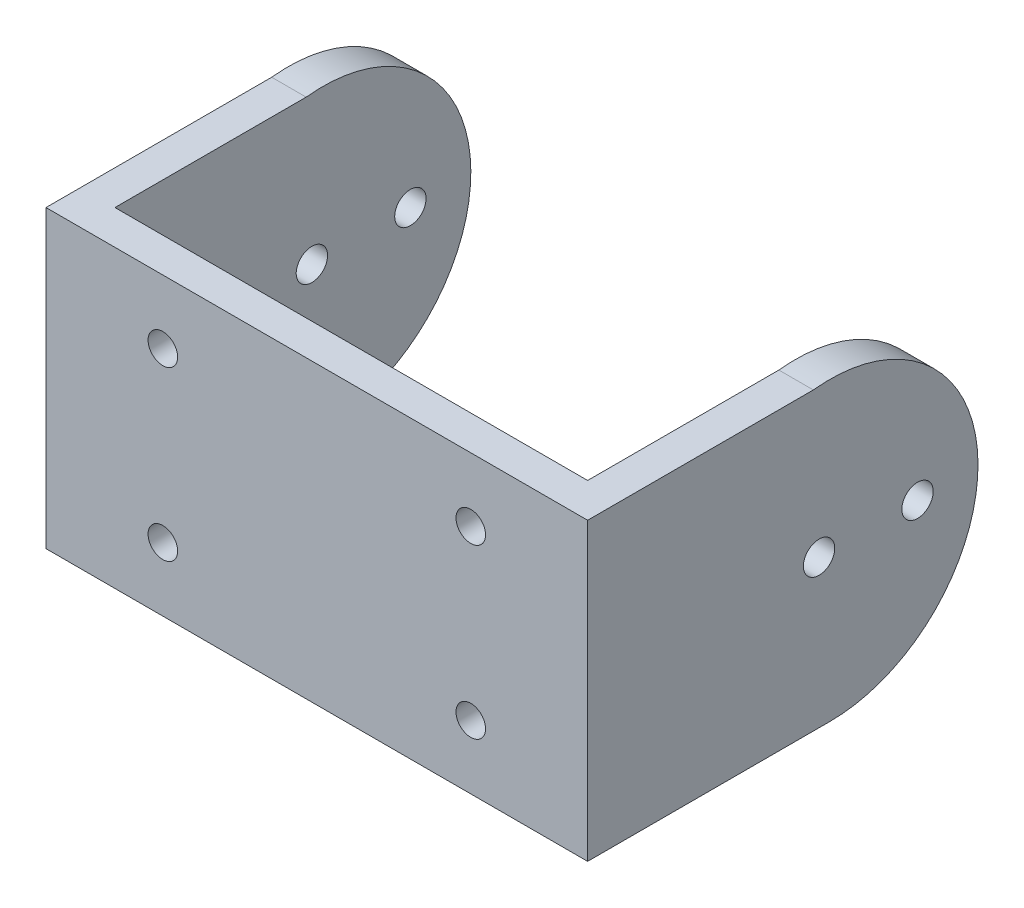
ISO-10303-21;
HEADER;
FILE_DESCRIPTION(('STEP AP214'),'2;1');
FILE_NAME('part.step','',(''),(''),'','','');
FILE_SCHEMA(('AUTOMOTIVE_DESIGN { 1 0 10303 214 1 1 1 1 }'));
ENDSEC;
DATA;
#1=APPLICATION_CONTEXT('core data for automotive mechanical design processes');
#2=APPLICATION_PROTOCOL_DEFINITION('international standard','automotive_design',2000,#1);
#3=PRODUCT_CONTEXT('',#1,'mechanical');
#4=PRODUCT('Part','Part','',(#3));
#5=PRODUCT_RELATED_PRODUCT_CATEGORY('part','',(#4));
#6=PRODUCT_DEFINITION_FORMATION('','',#4);
#7=PRODUCT_DEFINITION_CONTEXT('part definition',#1,'design');
#8=PRODUCT_DEFINITION('design','',#6,#7);
#9=PRODUCT_DEFINITION_SHAPE('','',#8);
#10=(LENGTH_UNIT() NAMED_UNIT(*) SI_UNIT(.MILLI.,.METRE.));
#11=(NAMED_UNIT(*) PLANE_ANGLE_UNIT() SI_UNIT($,.RADIAN.));
#12=(NAMED_UNIT(*) SI_UNIT($,.STERADIAN.) SOLID_ANGLE_UNIT());
#13=UNCERTAINTY_MEASURE_WITH_UNIT(LENGTH_MEASURE(1.E-05),#10,'distance_accuracy_value','');
#14=(GEOMETRIC_REPRESENTATION_CONTEXT(3) GLOBAL_UNCERTAINTY_ASSIGNED_CONTEXT((#13)) GLOBAL_UNIT_ASSIGNED_CONTEXT((#10,
#11,#12)) REPRESENTATION_CONTEXT('',''));
#15=CARTESIAN_POINT('',(0.,0.,0.));
#16=DIRECTION('',(0.,0.,1.));
#17=DIRECTION('',(1.,0.,0.));
#18=AXIS2_PLACEMENT_3D('',#15,#16,#17);
#19=CARTESIAN_POINT('',(0.,0.,3.5));
#20=DIRECTION('',(0.,0.,1.));
#21=DIRECTION('',(1.,0.,0.));
#22=AXIS2_PLACEMENT_3D('',#19,#20,#21);
#23=PLANE('',#22);
#24=CARTESIAN_POINT('',(15.6347464737621,-8.52804353114296,3.5));
#25=DIRECTION('',(0.,0.,1.));
#26=DIRECTION('',(-1.,0.,0.));
#27=AXIS2_PLACEMENT_3D('',#24,#25,#26);
#28=CIRCLE('',#27,1.5);
#29=CARTESIAN_POINT('',(14.1347464737621,-8.52804353114296,3.5));
#30=VERTEX_POINT('',#29);
#31=EDGE_CURVE('E201',#30,#30,#28,.T.);
#32=ORIENTED_EDGE('',*,*,#31,.F.);
#33=EDGE_LOOP('',(#32));
#34=FACE_BOUND('',#33,.T.);
#35=CARTESIAN_POINT('',(15.6347464737621,8.52804353114296,3.5));
#36=DIRECTION('',(0.,0.,1.));
#37=DIRECTION('',(1.,0.,0.));
#38=AXIS2_PLACEMENT_3D('',#35,#36,#37);
#39=CIRCLE('',#38,1.5);
#40=CARTESIAN_POINT('',(17.1347464737621,8.52804353114296,3.5));
#41=VERTEX_POINT('',#40);
#42=EDGE_CURVE('E217',#41,#41,#39,.T.);
#43=ORIENTED_EDGE('',*,*,#42,.F.);
#44=EDGE_LOOP('',(#43));
#45=FACE_BOUND('',#44,.T.);
#46=DIRECTION('',(0.,-1.,0.));
#47=VECTOR('',#46,1.);
#48=CARTESIAN_POINT('',(-27.5,-15.,3.5));
#49=LINE('',#48,#47);
#50=CARTESIAN_POINT('',(-27.5,15.,3.5));
#51=VERTEX_POINT('',#50);
#52=CARTESIAN_POINT('',(-27.5,-15.,3.5));
#53=VERTEX_POINT('',#52);
#54=EDGE_CURVE('E224',#51,#53,#49,.T.);
#55=ORIENTED_EDGE('',*,*,#54,.T.);
#56=DIRECTION('',(1.,0.,0.));
#57=VECTOR('',#56,1.);
#58=CARTESIAN_POINT('',(27.5,-15.,3.5));
#59=LINE('',#58,#57);
#60=CARTESIAN_POINT('',(27.5,-15.,3.5));
#61=VERTEX_POINT('',#60);
#62=EDGE_CURVE('E227',#53,#61,#59,.T.);
#63=ORIENTED_EDGE('',*,*,#62,.T.);
#64=DIRECTION('',(0.,1.,0.));
#65=VECTOR('',#64,1.);
#66=CARTESIAN_POINT('',(27.5,-15.,3.5));
#67=LINE('',#66,#65);
#68=CARTESIAN_POINT('',(27.5,15.,3.5));
#69=VERTEX_POINT('',#68);
#70=EDGE_CURVE('E230',#61,#69,#67,.T.);
#71=ORIENTED_EDGE('',*,*,#70,.T.);
#72=DIRECTION('',(-1.,0.,0.));
#73=VECTOR('',#72,1.);
#74=CARTESIAN_POINT('',(27.5,15.,3.5));
#75=LINE('',#74,#73);
#76=EDGE_CURVE('E63',#69,#51,#75,.T.);
#77=ORIENTED_EDGE('',*,*,#76,.T.);
#78=EDGE_LOOP('',(#55,#63,#71,#77));
#79=FACE_BOUND('',#78,.T.);
#80=CARTESIAN_POINT('',(-15.6347464737621,8.52804353114296,3.5));
#81=DIRECTION('',(0.,0.,1.));
#82=DIRECTION('',(-1.,0.,0.));
#83=AXIS2_PLACEMENT_3D('',#80,#81,#82);
#84=CIRCLE('',#83,1.5);
#85=CARTESIAN_POINT('',(-17.1347464737621,8.52804353114296,3.5));
#86=VERTEX_POINT('',#85);
#87=EDGE_CURVE('E209',#86,#86,#84,.T.);
#88=ORIENTED_EDGE('',*,*,#87,.F.);
#89=EDGE_LOOP('',(#88));
#90=FACE_BOUND('',#89,.T.);
#91=CARTESIAN_POINT('',(-15.6347464737621,-8.52804353114296,3.5));
#92=DIRECTION('',(0.,0.,1.));
#93=DIRECTION('',(1.,0.,0.));
#94=AXIS2_PLACEMENT_3D('',#91,#92,#93);
#95=CIRCLE('',#94,1.5);
#96=CARTESIAN_POINT('',(-14.1347464737621,-8.52804353114296,3.5));
#97=VERTEX_POINT('',#96);
#98=EDGE_CURVE('E193',#97,#97,#95,.T.);
#99=ORIENTED_EDGE('',*,*,#98,.F.);
#100=EDGE_LOOP('',(#99));
#101=FACE_BOUND('',#100,.T.);
#102=ADVANCED_FACE('F39',(#34,#45,#79,#90,#101),#23,.T.);
#103=CARTESIAN_POINT('',(0.,0.,0.));
#104=DIRECTION('',(0.,0.,1.));
#105=DIRECTION('',(1.,0.,0.));
#106=AXIS2_PLACEMENT_3D('',#103,#104,#105);
#107=PLANE('',#106);
#108=DIRECTION('',(1.,0.,0.));
#109=VECTOR('',#108,1.);
#110=CARTESIAN_POINT('',(27.5,-15.,0.));
#111=LINE('',#110,#109);
#112=CARTESIAN_POINT('',(-24.,-15.,0.));
#113=VERTEX_POINT('',#112);
#114=CARTESIAN_POINT('',(24.,-15.,0.));
#115=VERTEX_POINT('',#114);
#116=EDGE_CURVE('E55',#113,#115,#111,.T.);
#117=ORIENTED_EDGE('',*,*,#116,.F.);
#118=DIRECTION('',(0.,-1.,0.));
#119=VECTOR('',#118,1.);
#120=CARTESIAN_POINT('',(-24.,15.,0.));
#121=LINE('',#120,#119);
#122=CARTESIAN_POINT('',(-24.,15.,0.));
#123=VERTEX_POINT('',#122);
#124=EDGE_CURVE('E128',#123,#113,#121,.T.);
#125=ORIENTED_EDGE('',*,*,#124,.F.);
#126=DIRECTION('',(-1.,0.,0.));
#127=VECTOR('',#126,1.);
#128=CARTESIAN_POINT('',(27.5,15.,0.));
#129=LINE('',#128,#127);
#130=CARTESIAN_POINT('',(24.,15.,0.));
#131=VERTEX_POINT('',#130);
#132=EDGE_CURVE('E134',#131,#123,#129,.T.);
#133=ORIENTED_EDGE('',*,*,#132,.F.);
#134=DIRECTION('',(0.,-1.,0.));
#135=VECTOR('',#134,1.);
#136=CARTESIAN_POINT('',(24.,15.,0.));
#137=LINE('',#136,#135);
#138=EDGE_CURVE('E170',#131,#115,#137,.T.);
#139=ORIENTED_EDGE('',*,*,#138,.T.);
#140=EDGE_LOOP('',(#117,#125,#133,#139));
#141=FACE_BOUND('',#140,.T.);
#142=CARTESIAN_POINT('',(15.6347464737621,8.52804353114296,0.));
#143=DIRECTION('',(0.,0.,1.));
#144=DIRECTION('',(1.,0.,0.));
#145=AXIS2_PLACEMENT_3D('',#142,#143,#144);
#146=CIRCLE('',#145,1.5);
#147=CARTESIAN_POINT('',(17.1347464737621,8.52804353114296,0.));
#148=VERTEX_POINT('',#147);
#149=EDGE_CURVE('E213',#148,#148,#146,.T.);
#150=ORIENTED_EDGE('',*,*,#149,.T.);
#151=EDGE_LOOP('',(#150));
#152=FACE_BOUND('',#151,.T.);
#153=CARTESIAN_POINT('',(-15.6347464737621,8.52804353114296,0.));
#154=DIRECTION('',(0.,0.,1.));
#155=DIRECTION('',(-1.,0.,0.));
#156=AXIS2_PLACEMENT_3D('',#153,#154,#155);
#157=CIRCLE('',#156,1.5);
#158=CARTESIAN_POINT('',(-17.1347464737621,8.52804353114296,0.));
#159=VERTEX_POINT('',#158);
#160=EDGE_CURVE('E205',#159,#159,#157,.T.);
#161=ORIENTED_EDGE('',*,*,#160,.T.);
#162=EDGE_LOOP('',(#161));
#163=FACE_BOUND('',#162,.T.);
#164=CARTESIAN_POINT('',(15.6347464737621,-8.52804353114296,0.));
#165=DIRECTION('',(0.,0.,1.));
#166=DIRECTION('',(-1.,0.,0.));
#167=AXIS2_PLACEMENT_3D('',#164,#165,#166);
#168=CIRCLE('',#167,1.5);
#169=CARTESIAN_POINT('',(14.1347464737621,-8.52804353114296,0.));
#170=VERTEX_POINT('',#169);
#171=EDGE_CURVE('E197',#170,#170,#168,.T.);
#172=ORIENTED_EDGE('',*,*,#171,.T.);
#173=EDGE_LOOP('',(#172));
#174=FACE_BOUND('',#173,.T.);
#175=CARTESIAN_POINT('',(-15.6347464737621,-8.52804353114296,0.));
#176=DIRECTION('',(0.,0.,1.));
#177=DIRECTION('',(1.,0.,0.));
#178=AXIS2_PLACEMENT_3D('',#175,#176,#177);
#179=CIRCLE('',#178,1.5);
#180=CARTESIAN_POINT('',(-14.1347464737621,-8.52804353114296,0.));
#181=VERTEX_POINT('',#180);
#182=EDGE_CURVE('E189',#181,#181,#179,.T.);
#183=ORIENTED_EDGE('',*,*,#182,.T.);
#184=EDGE_LOOP('',(#183));
#185=FACE_BOUND('',#184,.T.);
#186=ADVANCED_FACE('F260',(#141,#152,#163,#174,#185),#107,.F.);
#187=CARTESIAN_POINT('',(-27.5,-15.,3.5));
#188=DIRECTION('',(1.,0.,0.));
#189=DIRECTION('',(0.,1.,0.));
#190=AXIS2_PLACEMENT_3D('',#187,#188,#189);
#191=PLANE('',#190);
#192=DIRECTION('',(0.,0.,-1.));
#193=VECTOR('',#192,1.);
#194=CARTESIAN_POINT('',(-27.5,15.,3.5));
#195=LINE('',#194,#193);
#196=CARTESIAN_POINT('',(-27.5,15.,-19.4197675165418));
#197=VERTEX_POINT('',#196);
#198=EDGE_CURVE('E235',#51,#197,#195,.T.);
#199=ORIENTED_EDGE('',*,*,#198,.T.);
#200=CARTESIAN_POINT('',(-27.5,0.046519708681584,-21.0930394173632));
#201=DIRECTION('',(1.,0.,0.));
#202=DIRECTION('',(0.,0.,1.));
#203=AXIS2_PLACEMENT_3D('',#200,#201,#202);
#204=CIRCLE('',#203,15.0468073582713);
#205=CARTESIAN_POINT('',(-27.5,-15.,-21.0000000000001));
#206=VERTEX_POINT('',#205);
#207=EDGE_CURVE('E124',#206,#197,#204,.T.);
#208=ORIENTED_EDGE('',*,*,#207,.F.);
#209=DIRECTION('',(0.,0.,-1.));
#210=VECTOR('',#209,1.);
#211=CARTESIAN_POINT('',(-27.5,-15.,3.5));
#212=LINE('',#211,#210);
#213=EDGE_CURVE('E11',#53,#206,#212,.T.);
#214=ORIENTED_EDGE('',*,*,#213,.F.);
#215=ORIENTED_EDGE('',*,*,#54,.F.);
#216=EDGE_LOOP('',(#199,#208,#214,#215));
#217=FACE_BOUND('',#216,.T.);
#218=CARTESIAN_POINT('',(-27.5,0.,-20.));
#219=DIRECTION('',(1.,0.,0.));
#220=DIRECTION('',(0.,0.,-1.));
#221=AXIS2_PLACEMENT_3D('',#218,#219,#220);
#222=CIRCLE('',#221,1.59272352570657);
#223=CARTESIAN_POINT('',(-27.5,0.,-21.5927235257066));
#224=VERTEX_POINT('',#223);
#225=EDGE_CURVE('E141',#224,#224,#222,.T.);
#226=ORIENTED_EDGE('',*,*,#225,.T.);
#227=EDGE_LOOP('',(#226));
#228=FACE_BOUND('',#227,.T.);
#229=CARTESIAN_POINT('',(-27.5,-1.81701141093459E-13,-30.));
#230=DIRECTION('',(1.,0.,0.));
#231=DIRECTION('',(0.,0.,1.));
#232=AXIS2_PLACEMENT_3D('',#229,#230,#231);
#233=CIRCLE('',#232,1.59272352570657);
#234=CARTESIAN_POINT('',(-27.5,-1.81701141093459E-13,-28.4072764742934));
#235=VERTEX_POINT('',#234);
#236=EDGE_CURVE('E458',#235,#235,#233,.T.);
#237=ORIENTED_EDGE('',*,*,#236,.T.);
#238=EDGE_LOOP('',(#237));
#239=FACE_BOUND('',#238,.T.);
#240=ADVANCED_FACE('F41',(#217,#228,#239),#191,.F.);
#241=CARTESIAN_POINT('',(27.5,-15.,3.5));
#242=DIRECTION('',(0.,1.,0.));
#243=DIRECTION('',(-1.,0.,0.));
#244=AXIS2_PLACEMENT_3D('',#241,#242,#243);
#245=PLANE('',#244);
#246=ORIENTED_EDGE('',*,*,#213,.T.);
#247=DIRECTION('',(-1.,0.,0.));
#248=VECTOR('',#247,1.);
#249=CARTESIAN_POINT('',(-24.,-15.,-21.0000000000001));
#250=LINE('',#249,#248);
#251=CARTESIAN_POINT('',(-24.,-15.,-21.0000000000001));
#252=VERTEX_POINT('',#251);
#253=EDGE_CURVE('E127',#252,#206,#250,.T.);
#254=ORIENTED_EDGE('',*,*,#253,.F.);
#255=DIRECTION('',(0.,0.,-1.));
#256=VECTOR('',#255,1.);
#257=CARTESIAN_POINT('',(-24.,-15.,0.));
#258=LINE('',#257,#256);
#259=EDGE_CURVE('E113',#113,#252,#258,.T.);
#260=ORIENTED_EDGE('',*,*,#259,.F.);
#261=ORIENTED_EDGE('',*,*,#116,.T.);
#262=DIRECTION('',(0.,0.,-1.));
#263=VECTOR('',#262,1.);
#264=CARTESIAN_POINT('',(24.,-15.,0.));
#265=LINE('',#264,#263);
#266=CARTESIAN_POINT('',(24.,-15.,-21.0000000000001));
#267=VERTEX_POINT('',#266);
#268=EDGE_CURVE('E174',#115,#267,#265,.T.);
#269=ORIENTED_EDGE('',*,*,#268,.T.);
#270=DIRECTION('',(1.,0.,0.));
#271=VECTOR('',#270,1.);
#272=CARTESIAN_POINT('',(24.,-15.,-21.0000000000001));
#273=LINE('',#272,#271);
#274=CARTESIAN_POINT('',(27.5,-15.,-21.0000000000001));
#275=VERTEX_POINT('',#274);
#276=EDGE_CURVE('E181',#267,#275,#273,.T.);
#277=ORIENTED_EDGE('',*,*,#276,.T.);
#278=DIRECTION('',(0.,0.,-1.));
#279=VECTOR('',#278,1.);
#280=CARTESIAN_POINT('',(27.5,-15.,3.5));
#281=LINE('',#280,#279);
#282=EDGE_CURVE('E48',#61,#275,#281,.T.);
#283=ORIENTED_EDGE('',*,*,#282,.F.);
#284=ORIENTED_EDGE('',*,*,#62,.F.);
#285=EDGE_LOOP('',(#246,#254,#260,#261,#269,#277,#283,#284));
#286=FACE_BOUND('',#285,.T.);
#287=ADVANCED_FACE('F252',(#286),#245,.F.);
#288=CARTESIAN_POINT('',(27.5,-15.,3.5));
#289=DIRECTION('',(-1.,0.,0.));
#290=DIRECTION('',(0.,0.,1.));
#291=AXIS2_PLACEMENT_3D('',#288,#289,#290);
#292=PLANE('',#291);
#293=ORIENTED_EDGE('',*,*,#282,.T.);
#294=CARTESIAN_POINT('',(27.5,0.046519708681584,-21.0930394173632));
#295=DIRECTION('',(1.,0.,0.));
#296=DIRECTION('',(0.,0.,1.));
#297=AXIS2_PLACEMENT_3D('',#294,#295,#296);
#298=CIRCLE('',#297,15.0468073582713);
#299=CARTESIAN_POINT('',(27.5,15.,-19.4197675165418));
#300=VERTEX_POINT('',#299);
#301=EDGE_CURVE('E163',#275,#300,#298,.T.);
#302=ORIENTED_EDGE('',*,*,#301,.T.);
#303=DIRECTION('',(0.,0.,-1.));
#304=VECTOR('',#303,1.);
#305=CARTESIAN_POINT('',(27.5,15.,3.5));
#306=LINE('',#305,#304);
#307=EDGE_CURVE('E242',#69,#300,#306,.T.);
#308=ORIENTED_EDGE('',*,*,#307,.F.);
#309=ORIENTED_EDGE('',*,*,#70,.F.);
#310=EDGE_LOOP('',(#293,#302,#308,#309));
#311=FACE_BOUND('',#310,.T.);
#312=CARTESIAN_POINT('',(27.5,-1.81701141093459E-13,-30.));
#313=DIRECTION('',(1.,0.,0.));
#314=DIRECTION('',(0.,0.,1.));
#315=AXIS2_PLACEMENT_3D('',#312,#313,#314);
#316=CIRCLE('',#315,1.59272352570657);
#317=CARTESIAN_POINT('',(27.5,-1.81701141093459E-13,-28.4072764742934));
#318=VERTEX_POINT('',#317);
#319=EDGE_CURVE('E149',#318,#318,#316,.T.);
#320=ORIENTED_EDGE('',*,*,#319,.F.);
#321=EDGE_LOOP('',(#320));
#322=FACE_BOUND('',#321,.T.);
#323=CARTESIAN_POINT('',(27.5,0.,-20.));
#324=DIRECTION('',(1.,0.,0.));
#325=DIRECTION('',(0.,0.,-1.));
#326=AXIS2_PLACEMENT_3D('',#323,#324,#325);
#327=CIRCLE('',#326,1.59272352570657);
#328=CARTESIAN_POINT('',(27.5,0.,-21.5927235257066));
#329=VERTEX_POINT('',#328);
#330=EDGE_CURVE('E155',#329,#329,#327,.T.);
#331=ORIENTED_EDGE('',*,*,#330,.F.);
#332=EDGE_LOOP('',(#331));
#333=FACE_BOUND('',#332,.T.);
#334=ADVANCED_FACE('F248',(#311,#322,#333),#292,.F.);
#335=CARTESIAN_POINT('',(27.5,15.,3.5));
#336=DIRECTION('',(0.,-1.,0.));
#337=DIRECTION('',(1.,0.,0.));
#338=AXIS2_PLACEMENT_3D('',#335,#336,#337);
#339=PLANE('',#338);
#340=ORIENTED_EDGE('',*,*,#307,.T.);
#341=DIRECTION('',(1.,0.,0.));
#342=VECTOR('',#341,1.);
#343=CARTESIAN_POINT('',(24.,15.,-19.4197675165418));
#344=LINE('',#343,#342);
#345=CARTESIAN_POINT('',(24.,15.,-19.4197675165418));
#346=VERTEX_POINT('',#345);
#347=EDGE_CURVE('E185',#346,#300,#344,.T.);
#348=ORIENTED_EDGE('',*,*,#347,.F.);
#349=DIRECTION('',(0.,0.,1.));
#350=VECTOR('',#349,1.);
#351=CARTESIAN_POINT('',(24.,15.,-19.4197675165418));
#352=LINE('',#351,#350);
#353=EDGE_CURVE('E167',#346,#131,#352,.T.);
#354=ORIENTED_EDGE('',*,*,#353,.T.);
#355=ORIENTED_EDGE('',*,*,#132,.T.);
#356=DIRECTION('',(0.,0.,1.));
#357=VECTOR('',#356,1.);
#358=CARTESIAN_POINT('',(-24.,15.,-19.4197675165418));
#359=LINE('',#358,#357);
#360=CARTESIAN_POINT('',(-24.,15.,-19.4197675165418));
#361=VERTEX_POINT('',#360);
#362=EDGE_CURVE('E111',#361,#123,#359,.T.);
#363=ORIENTED_EDGE('',*,*,#362,.F.);
#364=DIRECTION('',(-1.,0.,0.));
#365=VECTOR('',#364,1.);
#366=CARTESIAN_POINT('',(-24.,15.,-19.4197675165418));
#367=LINE('',#366,#365);
#368=EDGE_CURVE('E121',#361,#197,#367,.T.);
#369=ORIENTED_EDGE('',*,*,#368,.T.);
#370=ORIENTED_EDGE('',*,*,#198,.F.);
#371=ORIENTED_EDGE('',*,*,#76,.F.);
#372=EDGE_LOOP('',(#340,#348,#354,#355,#363,#369,#370,#371));
#373=FACE_BOUND('',#372,.T.);
#374=ADVANCED_FACE('F131',(#373),#339,.F.);
#375=CARTESIAN_POINT('',(15.6347464737621,8.52804353114296,3.5));
#376=DIRECTION('',(0.,0.,-1.));
#377=DIRECTION('',(-1.,0.,0.));
#378=AXIS2_PLACEMENT_3D('',#375,#376,#377);
#379=CYLINDRICAL_SURFACE('',#378,1.5);
#380=ORIENTED_EDGE('',*,*,#42,.T.);
#381=EDGE_LOOP('',(#380));
#382=FACE_BOUND('',#381,.T.);
#383=ORIENTED_EDGE('',*,*,#149,.F.);
#384=EDGE_LOOP('',(#383));
#385=FACE_BOUND('',#384,.T.);
#386=ADVANCED_FACE('F290',(#382,#385),#379,.F.);
#387=CARTESIAN_POINT('',(-15.6347464737621,8.52804353114296,3.5));
#388=DIRECTION('',(0.,0.,-1.));
#389=DIRECTION('',(-1.,0.,0.));
#390=AXIS2_PLACEMENT_3D('',#387,#388,#389);
#391=CYLINDRICAL_SURFACE('',#390,1.5);
#392=ORIENTED_EDGE('',*,*,#87,.T.);
#393=EDGE_LOOP('',(#392));
#394=FACE_BOUND('',#393,.T.);
#395=ORIENTED_EDGE('',*,*,#160,.F.);
#396=EDGE_LOOP('',(#395));
#397=FACE_BOUND('',#396,.T.);
#398=ADVANCED_FACE('F314',(#394,#397),#391,.F.);
#399=CARTESIAN_POINT('',(15.6347464737621,-8.52804353114296,3.5));
#400=DIRECTION('',(0.,0.,-1.));
#401=DIRECTION('',(-1.,0.,0.));
#402=AXIS2_PLACEMENT_3D('',#399,#400,#401);
#403=CYLINDRICAL_SURFACE('',#402,1.5);
#404=ORIENTED_EDGE('',*,*,#31,.T.);
#405=EDGE_LOOP('',(#404));
#406=FACE_BOUND('',#405,.T.);
#407=ORIENTED_EDGE('',*,*,#171,.F.);
#408=EDGE_LOOP('',(#407));
#409=FACE_BOUND('',#408,.T.);
#410=ADVANCED_FACE('F277',(#406,#409),#403,.F.);
#411=CARTESIAN_POINT('',(-15.6347464737621,-8.52804353114296,3.5));
#412=DIRECTION('',(0.,0.,-1.));
#413=DIRECTION('',(-1.,0.,0.));
#414=AXIS2_PLACEMENT_3D('',#411,#412,#413);
#415=CYLINDRICAL_SURFACE('',#414,1.5);
#416=ORIENTED_EDGE('',*,*,#98,.T.);
#417=EDGE_LOOP('',(#416));
#418=FACE_BOUND('',#417,.T.);
#419=ORIENTED_EDGE('',*,*,#182,.F.);
#420=EDGE_LOOP('',(#419));
#421=FACE_BOUND('',#420,.T.);
#422=ADVANCED_FACE('F274',(#418,#421),#415,.F.);
#423=CARTESIAN_POINT('',(24.,0.046519708681584,-21.0930394173632));
#424=DIRECTION('',(1.,0.,0.));
#425=DIRECTION('',(0.,0.,-1.));
#426=AXIS2_PLACEMENT_3D('',#423,#424,#425);
#427=CYLINDRICAL_SURFACE('',#426,15.0468073582713);
#428=ORIENTED_EDGE('',*,*,#301,.F.);
#429=ORIENTED_EDGE('',*,*,#276,.F.);
#430=CARTESIAN_POINT('',(24.,0.046519708681584,-21.0930394173632));
#431=DIRECTION('',(1.,0.,0.));
#432=DIRECTION('',(0.,0.,1.));
#433=AXIS2_PLACEMENT_3D('',#430,#431,#432);
#434=CIRCLE('',#433,15.0468073582713);
#435=EDGE_CURVE('E177',#267,#346,#434,.T.);
#436=ORIENTED_EDGE('',*,*,#435,.T.);
#437=ORIENTED_EDGE('',*,*,#347,.T.);
#438=EDGE_LOOP('',(#428,#429,#436,#437));
#439=FACE_BOUND('',#438,.T.);
#440=ADVANCED_FACE('F255',(#439),#427,.T.);
#441=CARTESIAN_POINT('',(24.,0.046519708681584,-21.0930394173632));
#442=DIRECTION('',(-1.,0.,0.));
#443=DIRECTION('',(0.,0.,1.));
#444=AXIS2_PLACEMENT_3D('',#441,#442,#443);
#445=PLANE('',#444);
#446=CARTESIAN_POINT('',(24.,-1.81701141093459E-13,-30.));
#447=DIRECTION('',(1.,0.,0.));
#448=DIRECTION('',(0.,0.,1.));
#449=AXIS2_PLACEMENT_3D('',#446,#447,#448);
#450=CIRCLE('',#449,1.59272352570657);
#451=CARTESIAN_POINT('',(24.,-1.81701141093459E-13,-28.4072764742934));
#452=VERTEX_POINT('',#451);
#453=EDGE_CURVE('E151',#452,#452,#450,.T.);
#454=ORIENTED_EDGE('',*,*,#453,.T.);
#455=EDGE_LOOP('',(#454));
#456=FACE_BOUND('',#455,.T.);
#457=CARTESIAN_POINT('',(24.,0.,-20.));
#458=DIRECTION('',(1.,0.,0.));
#459=DIRECTION('',(0.,0.,-1.));
#460=AXIS2_PLACEMENT_3D('',#457,#458,#459);
#461=CIRCLE('',#460,1.59272352570657);
#462=CARTESIAN_POINT('',(24.,0.,-21.5927235257066));
#463=VERTEX_POINT('',#462);
#464=EDGE_CURVE('E159',#463,#463,#461,.T.);
#465=ORIENTED_EDGE('',*,*,#464,.T.);
#466=EDGE_LOOP('',(#465));
#467=FACE_BOUND('',#466,.T.);
#468=ORIENTED_EDGE('',*,*,#353,.F.);
#469=ORIENTED_EDGE('',*,*,#435,.F.);
#470=ORIENTED_EDGE('',*,*,#268,.F.);
#471=ORIENTED_EDGE('',*,*,#138,.F.);
#472=EDGE_LOOP('',(#468,#469,#470,#471));
#473=FACE_BOUND('',#472,.T.);
#474=ADVANCED_FACE('F258',(#456,#467,#473),#445,.T.);
#475=CARTESIAN_POINT('',(24.,0.,-20.));
#476=DIRECTION('',(1.,0.,0.));
#477=DIRECTION('',(0.,0.,-1.));
#478=AXIS2_PLACEMENT_3D('',#475,#476,#477);
#479=CYLINDRICAL_SURFACE('',#478,1.59272352570657);
#480=ORIENTED_EDGE('',*,*,#464,.F.);
#481=EDGE_LOOP('',(#480));
#482=FACE_BOUND('',#481,.T.);
#483=ORIENTED_EDGE('',*,*,#330,.T.);
#484=EDGE_LOOP('',(#483));
#485=FACE_BOUND('',#484,.T.);
#486=ADVANCED_FACE('F344',(#482,#485),#479,.F.);
#487=CARTESIAN_POINT('',(24.,-1.81701141093459E-13,-30.));
#488=DIRECTION('',(1.,0.,0.));
#489=DIRECTION('',(0.,0.,-1.));
#490=AXIS2_PLACEMENT_3D('',#487,#488,#489);
#491=CYLINDRICAL_SURFACE('',#490,1.59272352570657);
#492=ORIENTED_EDGE('',*,*,#453,.F.);
#493=EDGE_LOOP('',(#492));
#494=FACE_BOUND('',#493,.T.);
#495=ORIENTED_EDGE('',*,*,#319,.T.);
#496=EDGE_LOOP('',(#495));
#497=FACE_BOUND('',#496,.T.);
#498=ADVANCED_FACE('F352',(#494,#497),#491,.F.);
#499=CARTESIAN_POINT('',(-24.,0.046519708681584,-21.0930394173632));
#500=DIRECTION('',(1.,0.,0.));
#501=DIRECTION('',(0.,0.,1.));
#502=AXIS2_PLACEMENT_3D('',#499,#500,#501);
#503=PLANE('',#502);
#504=CARTESIAN_POINT('',(-24.,0.,-20.));
#505=DIRECTION('',(1.,0.,0.));
#506=DIRECTION('',(0.,0.,-1.));
#507=AXIS2_PLACEMENT_3D('',#504,#505,#506);
#508=CIRCLE('',#507,1.59272352570657);
#509=CARTESIAN_POINT('',(-24.,0.,-21.5927235257066));
#510=VERTEX_POINT('',#509);
#511=EDGE_CURVE('E138',#510,#510,#508,.T.);
#512=ORIENTED_EDGE('',*,*,#511,.F.);
#513=EDGE_LOOP('',(#512));
#514=FACE_BOUND('',#513,.T.);
#515=ORIENTED_EDGE('',*,*,#362,.T.);
#516=ORIENTED_EDGE('',*,*,#124,.T.);
#517=ORIENTED_EDGE('',*,*,#259,.T.);
#518=CARTESIAN_POINT('',(-24.,0.046519708681584,-21.0930394173632));
#519=DIRECTION('',(1.,0.,0.));
#520=DIRECTION('',(0.,0.,1.));
#521=AXIS2_PLACEMENT_3D('',#518,#519,#520);
#522=CIRCLE('',#521,15.0468073582713);
#523=EDGE_CURVE('E106',#252,#361,#522,.T.);
#524=ORIENTED_EDGE('',*,*,#523,.T.);
#525=EDGE_LOOP('',(#515,#516,#517,#524));
#526=FACE_BOUND('',#525,.T.);
#527=CARTESIAN_POINT('',(-24.,-1.81701141093459E-13,-30.));
#528=DIRECTION('',(1.,0.,0.));
#529=DIRECTION('',(0.,0.,1.));
#530=AXIS2_PLACEMENT_3D('',#527,#528,#529);
#531=CIRCLE('',#530,1.59272352570657);
#532=CARTESIAN_POINT('',(-24.,-1.81701141093459E-13,-28.4072764742934));
#533=VERTEX_POINT('',#532);
#534=EDGE_CURVE('E455',#533,#533,#531,.T.);
#535=ORIENTED_EDGE('',*,*,#534,.F.);
#536=EDGE_LOOP('',(#535));
#537=FACE_BOUND('',#536,.T.);
#538=ADVANCED_FACE('F108',(#514,#526,#537),#503,.T.);
#539=CARTESIAN_POINT('',(-24.,0.046519708681584,-21.0930394173632));
#540=DIRECTION('',(-1.,0.,0.));
#541=DIRECTION('',(0.,0.,1.));
#542=AXIS2_PLACEMENT_3D('',#539,#540,#541);
#543=CYLINDRICAL_SURFACE('',#542,15.0468073582713);
#544=ORIENTED_EDGE('',*,*,#207,.T.);
#545=ORIENTED_EDGE('',*,*,#368,.F.);
#546=ORIENTED_EDGE('',*,*,#523,.F.);
#547=ORIENTED_EDGE('',*,*,#253,.T.);
#548=EDGE_LOOP('',(#544,#545,#546,#547));
#549=FACE_BOUND('',#548,.T.);
#550=ADVANCED_FACE('F122',(#549),#543,.T.);
#551=CARTESIAN_POINT('',(-24.,0.,-20.));
#552=DIRECTION('',(-1.,0.,0.));
#553=DIRECTION('',(0.,0.,1.));
#554=AXIS2_PLACEMENT_3D('',#551,#552,#553);
#555=CYLINDRICAL_SURFACE('',#554,1.59272352570657);
#556=ORIENTED_EDGE('',*,*,#511,.T.);
#557=EDGE_LOOP('',(#556));
#558=FACE_BOUND('',#557,.T.);
#559=ORIENTED_EDGE('',*,*,#225,.F.);
#560=EDGE_LOOP('',(#559));
#561=FACE_BOUND('',#560,.T.);
#562=ADVANCED_FACE('F373',(#558,#561),#555,.F.);
#563=CARTESIAN_POINT('',(-24.,-1.81701141093459E-13,-30.));
#564=DIRECTION('',(-1.,0.,0.));
#565=DIRECTION('',(0.,0.,1.));
#566=AXIS2_PLACEMENT_3D('',#563,#564,#565);
#567=CYLINDRICAL_SURFACE('',#566,1.59272352570657);
#568=ORIENTED_EDGE('',*,*,#534,.T.);
#569=EDGE_LOOP('',(#568));
#570=FACE_BOUND('',#569,.T.);
#571=ORIENTED_EDGE('',*,*,#236,.F.);
#572=EDGE_LOOP('',(#571));
#573=FACE_BOUND('',#572,.T.);
#574=ADVANCED_FACE('F380',(#570,#573),#567,.F.);
#575=CLOSED_SHELL('',(#102,#186,#240,#287,#334,#374,#386,#398,#410,#422,#440,#474,#486,#498,
#538,#550,#562,#574));
#576=MANIFOLD_SOLID_BREP('B2',#575);
#577=ADVANCED_BREP_SHAPE_REPRESENTATION('',(#18,#576),#14);
#578=SHAPE_DEFINITION_REPRESENTATION(#9,#577);
ENDSEC;
END-ISO-10303-21;
